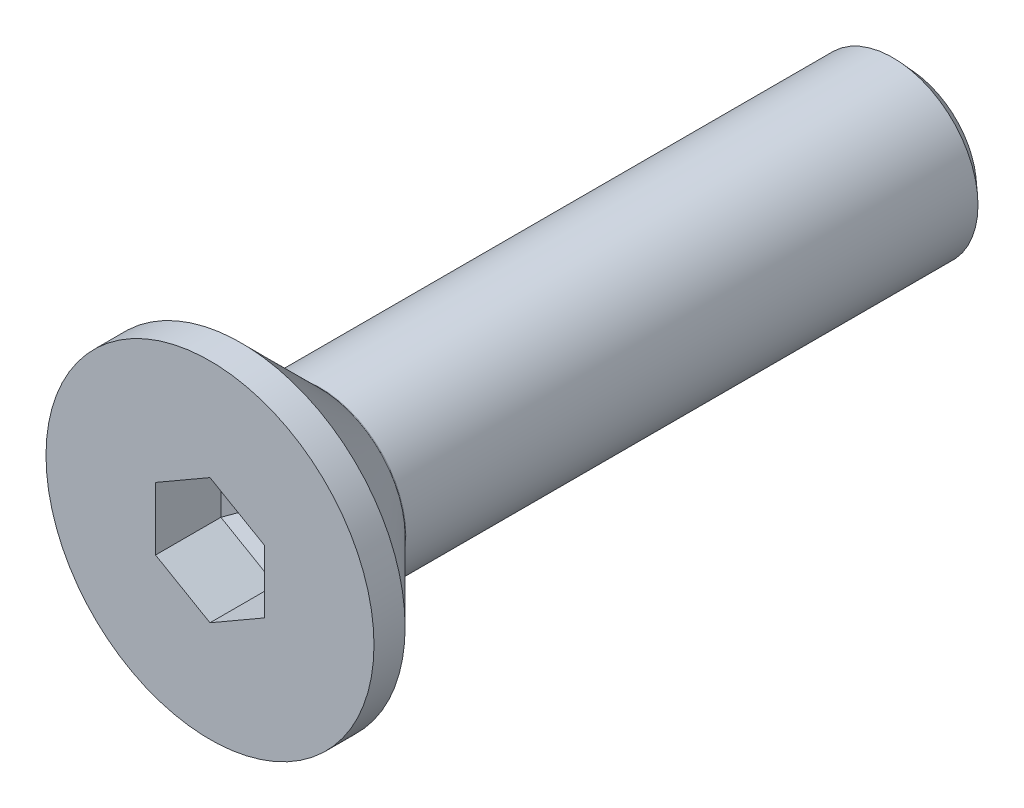
ISO-10303-21;
HEADER;
FILE_DESCRIPTION(('STEP AP214'),'2;1');
FILE_NAME('part.step','',(''),(''),'','','');
FILE_SCHEMA(('AUTOMOTIVE_DESIGN { 1 0 10303 214 1 1 1 1 }'));
ENDSEC;
DATA;
#1=APPLICATION_CONTEXT('core data for automotive mechanical design processes');
#2=APPLICATION_PROTOCOL_DEFINITION('international standard','automotive_design',2000,#1);
#3=PRODUCT_CONTEXT('',#1,'mechanical');
#4=PRODUCT('Part','Part','',(#3));
#5=PRODUCT_RELATED_PRODUCT_CATEGORY('part','',(#4));
#6=PRODUCT_DEFINITION_FORMATION('','',#4);
#7=PRODUCT_DEFINITION_CONTEXT('part definition',#1,'design');
#8=PRODUCT_DEFINITION('design','',#6,#7);
#9=PRODUCT_DEFINITION_SHAPE('','',#8);
#10=(LENGTH_UNIT() NAMED_UNIT(*) SI_UNIT(.MILLI.,.METRE.));
#11=(NAMED_UNIT(*) PLANE_ANGLE_UNIT() SI_UNIT($,.RADIAN.));
#12=(NAMED_UNIT(*) SI_UNIT($,.STERADIAN.) SOLID_ANGLE_UNIT());
#13=UNCERTAINTY_MEASURE_WITH_UNIT(LENGTH_MEASURE(1.E-05),#10,'distance_accuracy_value','');
#14=(GEOMETRIC_REPRESENTATION_CONTEXT(3) GLOBAL_UNCERTAINTY_ASSIGNED_CONTEXT((#13)) GLOBAL_UNIT_ASSIGNED_CONTEXT((#10,
#11,#12)) REPRESENTATION_CONTEXT('',''));
#15=CARTESIAN_POINT('',(0.,0.,0.));
#16=DIRECTION('',(0.,0.,1.));
#17=DIRECTION('',(1.,0.,0.));
#18=AXIS2_PLACEMENT_3D('',#15,#16,#17);
#19=CARTESIAN_POINT('',(0.,0.,-11.52));
#20=DIRECTION('',(0.,0.,-1.));
#21=DIRECTION('',(0.,-1.,0.));
#22=AXIS2_PLACEMENT_3D('',#19,#20,#21);
#23=PLANE('',#22);
#24=CARTESIAN_POINT('',(0.,0.,-11.52));
#25=DIRECTION('',(0.,0.,-1.));
#26=DIRECTION('',(-1.,0.,0.));
#27=AXIS2_PLACEMENT_3D('',#24,#25,#26);
#28=CIRCLE('',#27,1.6);
#29=CARTESIAN_POINT('',(1.6,0.,-11.52));
#30=VERTEX_POINT('',#29);
#31=EDGE_CURVE('E131',#30,#30,#28,.T.);
#32=ORIENTED_EDGE('',*,*,#31,.T.);
#33=EDGE_LOOP('',(#32));
#34=FACE_BOUND('',#33,.T.);
#35=ADVANCED_FACE('F17',(#34),#23,.T.);
#36=CARTESIAN_POINT('',(0.,0.,4.12249999999985));
#37=DIRECTION('',(0.,0.,-1.));
#38=DIRECTION('',(-1.,0.,0.));
#39=AXIS2_PLACEMENT_3D('',#36,#37,#38);
#40=CYLINDRICAL_SURFACE('',#39,3.765);
#41=CARTESIAN_POINT('',(0.,0.,3.76499999999983));
#42=DIRECTION('',(0.,0.,-1.));
#43=DIRECTION('',(1.,0.,0.));
#44=AXIS2_PLACEMENT_3D('',#41,#42,#43);
#45=CIRCLE('',#44,3.765);
#46=CARTESIAN_POINT('',(3.765,0.,3.76499999999983));
#47=VERTEX_POINT('',#46);
#48=EDGE_CURVE('E124',#47,#47,#45,.T.);
#49=ORIENTED_EDGE('',*,*,#48,.F.);
#50=DIRECTION('',(0.,0.,1.));
#51=VECTOR('',#50,1.);
#52=CARTESIAN_POINT('',(3.765,0.,4.12249999999985));
#53=LINE('',#52,#51);
#54=CARTESIAN_POINT('',(3.765,0.,4.47999999999987));
#55=VERTEX_POINT('',#54);
#56=EDGE_CURVE('E11',#47,#55,#53,.T.);
#57=ORIENTED_EDGE('',*,*,#56,.T.);
#58=CARTESIAN_POINT('',(0.,0.,4.47999999999987));
#59=DIRECTION('',(0.,0.,-1.));
#60=DIRECTION('',(1.,0.,0.));
#61=AXIS2_PLACEMENT_3D('',#58,#59,#60);
#62=CIRCLE('',#61,3.765);
#63=EDGE_CURVE('E25',#55,#55,#62,.T.);
#64=ORIENTED_EDGE('',*,*,#63,.T.);
#65=ORIENTED_EDGE('',*,*,#56,.F.);
#66=EDGE_LOOP('',(#49,#57,#64,#65));
#67=FACE_BOUND('',#66,.T.);
#68=ADVANCED_FACE('F239',(#67),#40,.T.);
#69=CARTESIAN_POINT('',(-3.765,0.,4.47999999999987));
#70=DIRECTION('',(0.,0.,1.));
#71=DIRECTION('',(1.,0.,0.));
#72=AXIS2_PLACEMENT_3D('',#69,#70,#71);
#73=PLANE('',#72);
#74=DIRECTION('',(0.866025403784439,-0.5,0.));
#75=VECTOR('',#74,1.);
#76=CARTESIAN_POINT('',(-1.099375,2.07810012516441,4.47999999999987));
#77=LINE('',#76,#75);
#78=CARTESIAN_POINT('',(0.,1.44337567297406,4.47999999999987));
#79=VERTEX_POINT('',#78);
#80=CARTESIAN_POINT('',(1.25,0.721687836487032,4.47999999999987));
#81=VERTEX_POINT('',#80);
#82=EDGE_CURVE('E162',#79,#81,#77,.T.);
#83=ORIENTED_EDGE('',*,*,#82,.T.);
#84=DIRECTION('',(0.,-1.,0.));
#85=VECTOR('',#84,1.);
#86=CARTESIAN_POINT('',(1.25,0.360843918243516,4.47999999999987));
#87=LINE('',#86,#85);
#88=CARTESIAN_POINT('',(1.25,-0.721687836487033,4.47999999999987));
#89=VERTEX_POINT('',#88);
#90=EDGE_CURVE('E44',#81,#89,#87,.T.);
#91=ORIENTED_EDGE('',*,*,#90,.T.);
#92=DIRECTION('',(-0.866025403784439,-0.5,0.));
#93=VECTOR('',#92,1.);
#94=CARTESIAN_POINT('',(-0.474375000000006,-1.71725620692089,4.47999999999987));
#95=LINE('',#94,#93);
#96=CARTESIAN_POINT('',(0.,-1.44337567297406,4.47999999999987));
#97=VERTEX_POINT('',#96);
#98=EDGE_CURVE('E209',#89,#97,#95,.T.);
#99=ORIENTED_EDGE('',*,*,#98,.T.);
#100=DIRECTION('',(-0.866025403784439,0.5,0.));
#101=VECTOR('',#100,1.);
#102=CARTESIAN_POINT('',(-1.724375,-0.447807302540203,4.47999999999987));
#103=LINE('',#102,#101);
#104=CARTESIAN_POINT('',(-1.25,-0.721687836487031,4.47999999999987));
#105=VERTEX_POINT('',#104);
#106=EDGE_CURVE('E210',#97,#105,#103,.T.);
#107=ORIENTED_EDGE('',*,*,#106,.T.);
#108=DIRECTION('',(0.,1.,0.));
#109=VECTOR('',#108,1.);
#110=CARTESIAN_POINT('',(-1.25,-0.360843918243515,4.47999999999987));
#111=LINE('',#110,#109);
#112=CARTESIAN_POINT('',(-1.25,0.721687836487033,4.47999999999987));
#113=VERTEX_POINT('',#112);
#114=EDGE_CURVE('E223',#105,#113,#111,.T.);
#115=ORIENTED_EDGE('',*,*,#114,.T.);
#116=DIRECTION('',(0.866025403784439,0.5,0.));
#117=VECTOR('',#116,1.);
#118=CARTESIAN_POINT('',(-2.349375,0.0869633842966876,4.47999999999987));
#119=LINE('',#118,#117);
#120=EDGE_CURVE('E195',#113,#79,#119,.T.);
#121=ORIENTED_EDGE('',*,*,#120,.T.);
#122=EDGE_LOOP('',(#83,#91,#99,#107,#115,#121));
#123=FACE_BOUND('',#122,.T.);
#124=ORIENTED_EDGE('',*,*,#63,.F.);
#125=EDGE_LOOP('',(#124));
#126=FACE_BOUND('',#125,.T.);
#127=ADVANCED_FACE('F241',(#123,#126),#73,.T.);
#128=CARTESIAN_POINT('',(1.25,0.721687836487032,4.47999999999987));
#129=DIRECTION('',(1.,0.,0.));
#130=DIRECTION('',(0.,0.,1.));
#131=AXIS2_PLACEMENT_3D('',#128,#129,#130);
#132=PLANE('',#131);
#133=ORIENTED_EDGE('',*,*,#90,.F.);
#134=DIRECTION('',(0.,0.,-1.));
#135=VECTOR('',#134,1.);
#136=CARTESIAN_POINT('',(1.25,0.721687836487032,4.47999999999987));
#137=LINE('',#136,#135);
#138=CARTESIAN_POINT('',(1.25,0.721687836487032,2.97999999999987));
#139=VERTEX_POINT('',#138);
#140=EDGE_CURVE('E192',#81,#139,#137,.T.);
#141=ORIENTED_EDGE('',*,*,#140,.T.);
#142=DIRECTION('',(0.,-1.,0.));
#143=VECTOR('',#142,1.);
#144=CARTESIAN_POINT('',(1.25,0.721687836487032,2.97999999999987));
#145=LINE('',#144,#143);
#146=CARTESIAN_POINT('',(1.25,-0.721687836487033,2.97999999999987));
#147=VERTEX_POINT('',#146);
#148=EDGE_CURVE('E166',#139,#147,#145,.T.);
#149=ORIENTED_EDGE('',*,*,#148,.T.);
#150=DIRECTION('',(0.,0.,-1.));
#151=VECTOR('',#150,1.);
#152=CARTESIAN_POINT('',(1.25,-0.721687836487033,4.47999999999987));
#153=LINE('',#152,#151);
#154=EDGE_CURVE('E231',#89,#147,#153,.T.);
#155=ORIENTED_EDGE('',*,*,#154,.F.);
#156=EDGE_LOOP('',(#133,#141,#149,#155));
#157=FACE_BOUND('',#156,.T.);
#158=ADVANCED_FACE('F243',(#157),#132,.F.);
#159=CARTESIAN_POINT('',(1.25,-0.721687836487033,4.47999999999987));
#160=DIRECTION('',(0.5,-0.866025403784439,0.));
#161=DIRECTION('',(0.,0.,-1.));
#162=AXIS2_PLACEMENT_3D('',#159,#160,#161);
#163=PLANE('',#162);
#164=ORIENTED_EDGE('',*,*,#98,.F.);
#165=ORIENTED_EDGE('',*,*,#154,.T.);
#166=DIRECTION('',(-0.866025403784439,-0.5,0.));
#167=VECTOR('',#166,1.);
#168=CARTESIAN_POINT('',(1.25,-0.721687836487033,2.97999999999987));
#169=LINE('',#168,#167);
#170=CARTESIAN_POINT('',(0.,-1.44337567297406,2.97999999999987));
#171=VERTEX_POINT('',#170);
#172=EDGE_CURVE('E179',#147,#171,#169,.T.);
#173=ORIENTED_EDGE('',*,*,#172,.T.);
#174=DIRECTION('',(0.,0.,-1.));
#175=VECTOR('',#174,1.);
#176=CARTESIAN_POINT('',(0.,-1.44337567297406,4.47999999999987));
#177=LINE('',#176,#175);
#178=EDGE_CURVE('E206',#97,#171,#177,.T.);
#179=ORIENTED_EDGE('',*,*,#178,.F.);
#180=EDGE_LOOP('',(#164,#165,#173,#179));
#181=FACE_BOUND('',#180,.T.);
#182=ADVANCED_FACE('F251',(#181),#163,.F.);
#183=CARTESIAN_POINT('',(0.,-1.44337567297406,4.47999999999987));
#184=DIRECTION('',(-0.5,-0.866025403784439,0.));
#185=DIRECTION('',(-0.866025403784439,0.5,0.));
#186=AXIS2_PLACEMENT_3D('',#183,#184,#185);
#187=PLANE('',#186);
#188=ORIENTED_EDGE('',*,*,#106,.F.);
#189=ORIENTED_EDGE('',*,*,#178,.T.);
#190=DIRECTION('',(-0.866025403784439,0.5,0.));
#191=VECTOR('',#190,1.);
#192=CARTESIAN_POINT('',(0.,-1.44337567297406,2.97999999999987));
#193=LINE('',#192,#191);
#194=CARTESIAN_POINT('',(-1.25,-0.721687836487031,2.97999999999987));
#195=VERTEX_POINT('',#194);
#196=EDGE_CURVE('E199',#171,#195,#193,.T.);
#197=ORIENTED_EDGE('',*,*,#196,.T.);
#198=DIRECTION('',(0.,0.,-1.));
#199=VECTOR('',#198,1.);
#200=CARTESIAN_POINT('',(-1.25,-0.721687836487031,4.47999999999987));
#201=LINE('',#200,#199);
#202=EDGE_CURVE('E224',#105,#195,#201,.T.);
#203=ORIENTED_EDGE('',*,*,#202,.F.);
#204=EDGE_LOOP('',(#188,#189,#197,#203));
#205=FACE_BOUND('',#204,.T.);
#206=ADVANCED_FACE('F343',(#205),#187,.F.);
#207=CARTESIAN_POINT('',(-1.25,-0.721687836487031,4.47999999999987));
#208=DIRECTION('',(-1.,0.,0.));
#209=DIRECTION('',(0.,1.,0.));
#210=AXIS2_PLACEMENT_3D('',#207,#208,#209);
#211=PLANE('',#210);
#212=ORIENTED_EDGE('',*,*,#114,.F.);
#213=ORIENTED_EDGE('',*,*,#202,.T.);
#214=DIRECTION('',(0.,1.,0.));
#215=VECTOR('',#214,1.);
#216=CARTESIAN_POINT('',(-1.25,-0.721687836487032,2.97999999999987));
#217=LINE('',#216,#215);
#218=CARTESIAN_POINT('',(-1.25,0.721687836487033,2.97999999999987));
#219=VERTEX_POINT('',#218);
#220=EDGE_CURVE('E158',#195,#219,#217,.T.);
#221=ORIENTED_EDGE('',*,*,#220,.T.);
#222=DIRECTION('',(0.,0.,-1.));
#223=VECTOR('',#222,1.);
#224=CARTESIAN_POINT('',(-1.25,0.721687836487033,4.47999999999987));
#225=LINE('',#224,#223);
#226=EDGE_CURVE('E220',#113,#219,#225,.T.);
#227=ORIENTED_EDGE('',*,*,#226,.F.);
#228=EDGE_LOOP('',(#212,#213,#221,#227));
#229=FACE_BOUND('',#228,.T.);
#230=ADVANCED_FACE('F338',(#229),#211,.F.);
#231=CARTESIAN_POINT('',(-1.25,0.721687836487032,4.47999999999987));
#232=DIRECTION('',(-0.5,0.866025403784439,0.));
#233=DIRECTION('',(0.,0.,1.));
#234=AXIS2_PLACEMENT_3D('',#231,#232,#233);
#235=PLANE('',#234);
#236=ORIENTED_EDGE('',*,*,#120,.F.);
#237=ORIENTED_EDGE('',*,*,#226,.T.);
#238=DIRECTION('',(0.866025403784439,0.5,0.));
#239=VECTOR('',#238,1.);
#240=CARTESIAN_POINT('',(-1.25,0.721687836487032,2.97999999999987));
#241=LINE('',#240,#239);
#242=CARTESIAN_POINT('',(0.,1.44337567297406,2.97999999999987));
#243=VERTEX_POINT('',#242);
#244=EDGE_CURVE('E159',#219,#243,#241,.T.);
#245=ORIENTED_EDGE('',*,*,#244,.T.);
#246=DIRECTION('',(0.,0.,-1.));
#247=VECTOR('',#246,1.);
#248=CARTESIAN_POINT('',(0.,1.44337567297406,4.47999999999987));
#249=LINE('',#248,#247);
#250=EDGE_CURVE('E165',#79,#243,#249,.T.);
#251=ORIENTED_EDGE('',*,*,#250,.F.);
#252=EDGE_LOOP('',(#236,#237,#245,#251));
#253=FACE_BOUND('',#252,.T.);
#254=ADVANCED_FACE('F325',(#253),#235,.F.);
#255=CARTESIAN_POINT('',(0.,1.44337567297406,4.47999999999987));
#256=DIRECTION('',(0.5,0.866025403784439,0.));
#257=DIRECTION('',(0.,0.,-1.));
#258=AXIS2_PLACEMENT_3D('',#255,#256,#257);
#259=PLANE('',#258);
#260=ORIENTED_EDGE('',*,*,#82,.F.);
#261=ORIENTED_EDGE('',*,*,#250,.T.);
#262=DIRECTION('',(0.866025403784439,-0.5,0.));
#263=VECTOR('',#262,1.);
#264=CARTESIAN_POINT('',(0.,1.44337567297406,2.97999999999987));
#265=LINE('',#264,#263);
#266=EDGE_CURVE('E149',#243,#139,#265,.T.);
#267=ORIENTED_EDGE('',*,*,#266,.T.);
#268=ORIENTED_EDGE('',*,*,#140,.F.);
#269=EDGE_LOOP('',(#260,#261,#267,#268));
#270=FACE_BOUND('',#269,.T.);
#271=ADVANCED_FACE('F320',(#270),#259,.F.);
#272=CARTESIAN_POINT('',(1.25,-0.721687836487033,2.97999999999987));
#273=DIRECTION('',(0.5,0.,-0.866025403784439));
#274=DIRECTION('',(0.,-1.,0.));
#275=AXIS2_PLACEMENT_3D('',#272,#273,#274);
#276=PLANE('',#275);
#277=DIRECTION('',(-0.774596669241483,0.447213595499958,-0.447213595499958));
#278=VECTOR('',#277,1.);
#279=CARTESIAN_POINT('',(1.,-0.577350269189626,2.83566243270246));
#280=LINE('',#279,#278);
#281=CARTESIAN_POINT('',(0.,0.,2.25831216351284));
#282=VERTEX_POINT('',#281);
#283=EDGE_CURVE('E183',#147,#282,#280,.T.);
#284=ORIENTED_EDGE('',*,*,#283,.F.);
#285=ORIENTED_EDGE('',*,*,#148,.F.);
#286=DIRECTION('',(-0.774596669241483,-0.447213595499958,-0.447213595499958));
#287=VECTOR('',#286,1.);
#288=CARTESIAN_POINT('',(1.,0.577350269189626,2.83566243270246));
#289=LINE('',#288,#287);
#290=EDGE_CURVE('E123',#139,#282,#289,.T.);
#291=ORIENTED_EDGE('',*,*,#290,.T.);
#292=EDGE_LOOP('',(#284,#285,#291));
#293=FACE_BOUND('',#292,.T.);
#294=ADVANCED_FACE('F314',(#293),#276,.F.);
#295=CARTESIAN_POINT('',(0.,-1.44337567297406,2.97999999999987));
#296=DIRECTION('',(0.25,-0.43301270189222,-0.866025403784439));
#297=DIRECTION('',(0.,-0.894427190999916,0.447213595499959));
#298=AXIS2_PLACEMENT_3D('',#295,#296,#297);
#299=PLANE('',#298);
#300=DIRECTION('',(0.,0.894427190999916,-0.447213595499958));
#301=VECTOR('',#300,1.);
#302=CARTESIAN_POINT('',(0.,-1.15470053837925,2.83566243270246));
#303=LINE('',#302,#301);
#304=EDGE_CURVE('E184',#171,#282,#303,.T.);
#305=ORIENTED_EDGE('',*,*,#304,.F.);
#306=ORIENTED_EDGE('',*,*,#172,.F.);
#307=ORIENTED_EDGE('',*,*,#283,.T.);
#308=EDGE_LOOP('',(#305,#306,#307));
#309=FACE_BOUND('',#308,.T.);
#310=ADVANCED_FACE('F309',(#309),#299,.F.);
#311=CARTESIAN_POINT('',(-1.25,-0.721687836487031,2.97999999999987));
#312=DIRECTION('',(-0.25,-0.433012701892219,-0.866025403784439));
#313=DIRECTION('',(0.,-0.894427190999916,0.447213595499958));
#314=AXIS2_PLACEMENT_3D('',#311,#312,#313);
#315=PLANE('',#314);
#316=DIRECTION('',(0.774596669241483,0.447213595499958,-0.447213595499958));
#317=VECTOR('',#316,1.);
#318=CARTESIAN_POINT('',(-1.,-0.577350269189626,2.83566243270246));
#319=LINE('',#318,#317);
#320=EDGE_CURVE('E191',#195,#282,#319,.T.);
#321=ORIENTED_EDGE('',*,*,#320,.F.);
#322=ORIENTED_EDGE('',*,*,#196,.F.);
#323=ORIENTED_EDGE('',*,*,#304,.T.);
#324=EDGE_LOOP('',(#321,#322,#323));
#325=FACE_BOUND('',#324,.T.);
#326=ADVANCED_FACE('F295',(#325),#315,.F.);
#327=CARTESIAN_POINT('',(-1.25,0.721687836487033,2.97999999999987));
#328=DIRECTION('',(-0.5,0.,-0.866025403784439));
#329=DIRECTION('',(-0.866025403784439,0.,0.5));
#330=AXIS2_PLACEMENT_3D('',#327,#328,#329);
#331=PLANE('',#330);
#332=DIRECTION('',(0.774596669241484,-0.447213595499958,-0.447213595499958));
#333=VECTOR('',#332,1.);
#334=CARTESIAN_POINT('',(-1.,0.577350269189625,2.83566243270246));
#335=LINE('',#334,#333);
#336=EDGE_CURVE('E154',#219,#282,#335,.T.);
#337=ORIENTED_EDGE('',*,*,#336,.F.);
#338=ORIENTED_EDGE('',*,*,#220,.F.);
#339=ORIENTED_EDGE('',*,*,#320,.T.);
#340=EDGE_LOOP('',(#337,#338,#339));
#341=FACE_BOUND('',#340,.T.);
#342=ADVANCED_FACE('F299',(#341),#331,.F.);
#343=CARTESIAN_POINT('',(0.,1.44337567297406,2.97999999999987));
#344=DIRECTION('',(-0.25,0.433012701892219,-0.866025403784439));
#345=DIRECTION('',(-0.960768922830523,0.,0.277350098112614));
#346=AXIS2_PLACEMENT_3D('',#343,#344,#345);
#347=PLANE('',#346);
#348=DIRECTION('',(0.,-0.894427190999916,-0.447213595499958));
#349=VECTOR('',#348,1.);
#350=CARTESIAN_POINT('',(0.,1.15470053837925,2.83566243270246));
#351=LINE('',#350,#349);
#352=EDGE_CURVE('E175',#243,#282,#351,.T.);
#353=ORIENTED_EDGE('',*,*,#352,.F.);
#354=ORIENTED_EDGE('',*,*,#244,.F.);
#355=ORIENTED_EDGE('',*,*,#336,.T.);
#356=EDGE_LOOP('',(#353,#354,#355));
#357=FACE_BOUND('',#356,.T.);
#358=ADVANCED_FACE('F304',(#357),#347,.F.);
#359=CARTESIAN_POINT('',(1.25,0.721687836487032,2.97999999999987));
#360=DIRECTION('',(0.25,0.433012701892219,-0.866025403784439));
#361=DIRECTION('',(-0.960768922830523,0.,-0.277350098112614));
#362=AXIS2_PLACEMENT_3D('',#359,#360,#361);
#363=PLANE('',#362);
#364=ORIENTED_EDGE('',*,*,#290,.F.);
#365=ORIENTED_EDGE('',*,*,#266,.F.);
#366=ORIENTED_EDGE('',*,*,#352,.T.);
#367=EDGE_LOOP('',(#364,#365,#366));
#368=FACE_BOUND('',#367,.T.);
#369=ADVANCED_FACE('F404',(#368),#363,.F.);
#370=CARTESIAN_POINT('',(0.,0.,-4.76000000000013));
#371=DIRECTION('',(0.,0.,-1.));
#372=DIRECTION('',(-1.,0.,0.));
#373=AXIS2_PLACEMENT_3D('',#370,#371,#372);
#374=CYLINDRICAL_SURFACE('',#373,1.954);
#375=CARTESIAN_POINT('',(0.,0.,-11.1981818181819));
#376=DIRECTION('',(0.,0.,1.));
#377=DIRECTION('',(-1.,0.,0.));
#378=AXIS2_PLACEMENT_3D('',#375,#376,#377);
#379=CIRCLE('',#378,1.954);
#380=CARTESIAN_POINT('',(1.954,0.,-11.1981818181819));
#381=VERTEX_POINT('',#380);
#382=EDGE_CURVE('E118',#381,#381,#379,.T.);
#383=ORIENTED_EDGE('',*,*,#382,.T.);
#384=DIRECTION('',(0.,0.,1.));
#385=VECTOR('',#384,1.);
#386=CARTESIAN_POINT('',(1.954,0.,-4.76000000000013));
#387=LINE('',#386,#385);
#388=CARTESIAN_POINT('',(1.954,0.,1.93743145750499));
#389=VERTEX_POINT('',#388);
#390=EDGE_CURVE('E114',#381,#389,#387,.T.);
#391=ORIENTED_EDGE('',*,*,#390,.T.);
#392=CARTESIAN_POINT('',(0.,0.,1.93743145750499));
#393=DIRECTION('',(0.,0.,1.));
#394=DIRECTION('',(-1.,0.,0.));
#395=AXIS2_PLACEMENT_3D('',#392,#393,#394);
#396=CIRCLE('',#395,1.954);
#397=EDGE_CURVE('E120',#389,#389,#396,.T.);
#398=ORIENTED_EDGE('',*,*,#397,.F.);
#399=ORIENTED_EDGE('',*,*,#390,.F.);
#400=EDGE_LOOP('',(#383,#391,#398,#399));
#401=FACE_BOUND('',#400,.T.);
#402=ADVANCED_FACE('F116',(#401),#374,.T.);
#403=CARTESIAN_POINT('',(0.,0.,2.88249999999985));
#404=DIRECTION('',(0.,0.,1.));
#405=DIRECTION('',(-1.,0.,0.));
#406=AXIS2_PLACEMENT_3D('',#403,#404,#405);
#407=CONICAL_SURFACE('',#406,2.8825,0.785398163397469);
#408=CARTESIAN_POINT('',(0.,0.,1.96571572875246));
#409=DIRECTION('',(0.,0.,-1.));
#410=DIRECTION('',(-1.,0.,0.));
#411=AXIS2_PLACEMENT_3D('',#408,#409,#410);
#412=CIRCLE('',#411,1.96571572875254);
#413=CARTESIAN_POINT('',(1.96571572875254,0.,1.96571572875246));
#414=VERTEX_POINT('',#413);
#415=EDGE_CURVE('E139',#414,#414,#412,.T.);
#416=ORIENTED_EDGE('',*,*,#415,.F.);
#417=DIRECTION('',(0.707106781186562,0.,0.707106781186533));
#418=VECTOR('',#417,1.);
#419=CARTESIAN_POINT('',(2.8825,0.,2.88249999999985));
#420=LINE('',#419,#418);
#421=EDGE_CURVE('E143',#414,#47,#420,.T.);
#422=ORIENTED_EDGE('',*,*,#421,.T.);
#423=ORIENTED_EDGE('',*,*,#48,.T.);
#424=ORIENTED_EDGE('',*,*,#421,.F.);
#425=EDGE_LOOP('',(#416,#422,#423,#424));
#426=FACE_BOUND('',#425,.T.);
#427=ADVANCED_FACE('F424',(#426),#407,.T.);
#428=CARTESIAN_POINT('',(0.,0.,1.93743145750499));
#429=DIRECTION('',(0.,0.,-1.));
#430=DIRECTION('',(-1.,0.,0.));
#431=AXIS2_PLACEMENT_3D('',#428,#429,#430);
#432=TOROIDAL_SURFACE('',#431,1.994,0.04);
#433=ORIENTED_EDGE('',*,*,#415,.T.);
#434=CARTESIAN_POINT('',(1.994,0.,1.93743145750499));
#435=DIRECTION('',(0.,-1.,0.));
#436=DIRECTION('',(1.,0.,0.));
#437=AXIS2_PLACEMENT_3D('',#434,#435,#436);
#438=CIRCLE('',#437,0.04);
#439=EDGE_CURVE('E153',#414,#389,#438,.T.);
#440=ORIENTED_EDGE('',*,*,#439,.T.);
#441=ORIENTED_EDGE('',*,*,#397,.T.);
#442=ORIENTED_EDGE('',*,*,#439,.F.);
#443=EDGE_LOOP('',(#433,#440,#441,#442));
#444=FACE_BOUND('',#443,.T.);
#445=ADVANCED_FACE('F434',(#444),#432,.F.);
#446=CARTESIAN_POINT('',(0.,0.,-11.32));
#447=DIRECTION('',(0.,0.,1.));
#448=DIRECTION('',(-1.,0.,0.));
#449=AXIS2_PLACEMENT_3D('',#446,#447,#448);
#450=CONICAL_SURFACE('',#449,1.82,0.832981266674425);
#451=ORIENTED_EDGE('',*,*,#382,.F.);
#452=DIRECTION('',(-0.739940073395939,0.,-0.672672793996317));
#453=VECTOR('',#452,1.);
#454=CARTESIAN_POINT('',(1.82,0.,-11.32));
#455=LINE('',#454,#453);
#456=EDGE_CURVE('E129',#381,#30,#455,.T.);
#457=ORIENTED_EDGE('',*,*,#456,.T.);
#458=ORIENTED_EDGE('',*,*,#31,.F.);
#459=ORIENTED_EDGE('',*,*,#456,.F.);
#460=EDGE_LOOP('',(#451,#457,#458,#459));
#461=FACE_BOUND('',#460,.T.);
#462=ADVANCED_FACE('F130',(#461),#450,.T.);
#463=CLOSED_SHELL('',(#35,#68,#127,#158,#182,#206,#230,#254,#271,#294,#310,#326,#342,#358,#369,
#402,#427,#445,#462));
#464=MANIFOLD_SOLID_BREP('B1',#463);
#465=ADVANCED_BREP_SHAPE_REPRESENTATION('',(#18,#464),#14);
#466=SHAPE_DEFINITION_REPRESENTATION(#9,#465);
ENDSEC;
END-ISO-10303-21;
